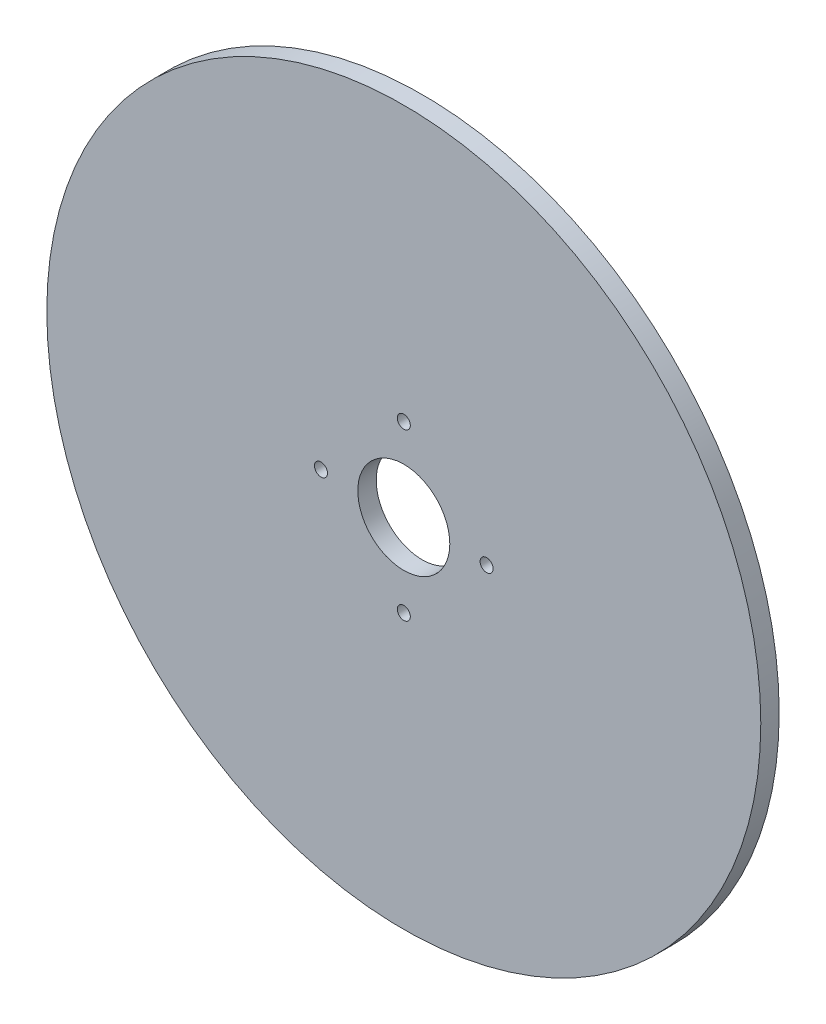
ISO-10303-21;
HEADER;
FILE_DESCRIPTION(('STEP AP214'),'2;1');
FILE_NAME('part.step','',(''),(''),'','','');
FILE_SCHEMA(('AUTOMOTIVE_DESIGN { 1 0 10303 214 1 1 1 1 }'));
ENDSEC;
DATA;
#1=APPLICATION_CONTEXT('core data for automotive mechanical design processes');
#2=APPLICATION_PROTOCOL_DEFINITION('international standard','automotive_design',2000,#1);
#3=PRODUCT_CONTEXT('',#1,'mechanical');
#4=PRODUCT('Part','Part','',(#3));
#5=PRODUCT_RELATED_PRODUCT_CATEGORY('part','',(#4));
#6=PRODUCT_DEFINITION_FORMATION('','',#4);
#7=PRODUCT_DEFINITION_CONTEXT('part definition',#1,'design');
#8=PRODUCT_DEFINITION('design','',#6,#7);
#9=PRODUCT_DEFINITION_SHAPE('','',#8);
#10=(LENGTH_UNIT() NAMED_UNIT(*) SI_UNIT(.MILLI.,.METRE.));
#11=(NAMED_UNIT(*) PLANE_ANGLE_UNIT() SI_UNIT($,.RADIAN.));
#12=(NAMED_UNIT(*) SI_UNIT($,.STERADIAN.) SOLID_ANGLE_UNIT());
#13=UNCERTAINTY_MEASURE_WITH_UNIT(LENGTH_MEASURE(1.E-05),#10,'distance_accuracy_value','');
#14=(GEOMETRIC_REPRESENTATION_CONTEXT(3) GLOBAL_UNCERTAINTY_ASSIGNED_CONTEXT((#13)) GLOBAL_UNIT_ASSIGNED_CONTEXT((#10,
#11,#12)) REPRESENTATION_CONTEXT('',''));
#15=CARTESIAN_POINT('',(0.,0.,0.));
#16=DIRECTION('',(0.,0.,1.));
#17=DIRECTION('',(1.,0.,0.));
#18=AXIS2_PLACEMENT_3D('',#15,#16,#17);
#19=CARTESIAN_POINT('',(0.,0.,6.35));
#20=DIRECTION('',(0.,0.,1.));
#21=DIRECTION('',(1.,0.,0.));
#22=AXIS2_PLACEMENT_3D('',#19,#20,#21);
#23=PLANE('',#22);
#24=CARTESIAN_POINT('',(28.575,0.,6.35));
#25=DIRECTION('',(0.,0.,1.));
#26=DIRECTION('',(1.,0.,0.));
#27=AXIS2_PLACEMENT_3D('',#24,#25,#26);
#28=CIRCLE('',#27,2.25);
#29=CARTESIAN_POINT('',(30.825,0.,6.35));
#30=VERTEX_POINT('',#29);
#31=EDGE_CURVE('E70',#30,#30,#28,.T.);
#32=ORIENTED_EDGE('',*,*,#31,.F.);
#33=EDGE_LOOP('',(#32));
#34=FACE_BOUND('',#33,.T.);
#35=CARTESIAN_POINT('',(0.,28.575,6.35));
#36=DIRECTION('',(0.,0.,1.));
#37=DIRECTION('',(1.,0.,0.));
#38=AXIS2_PLACEMENT_3D('',#35,#36,#37);
#39=CIRCLE('',#38,2.25);
#40=CARTESIAN_POINT('',(2.25000000000001,28.575,6.35));
#41=VERTEX_POINT('',#40);
#42=EDGE_CURVE('E54',#41,#41,#39,.T.);
#43=ORIENTED_EDGE('',*,*,#42,.F.);
#44=EDGE_LOOP('',(#43));
#45=FACE_BOUND('',#44,.T.);
#46=CARTESIAN_POINT('',(0.,0.,6.35));
#47=DIRECTION('',(0.,0.,1.));
#48=DIRECTION('',(1.,0.,0.));
#49=AXIS2_PLACEMENT_3D('',#46,#47,#48);
#50=CIRCLE('',#49,123.19);
#51=CARTESIAN_POINT('',(123.19,0.,6.35));
#52=VERTEX_POINT('',#51);
#53=EDGE_CURVE('E10',#52,#52,#50,.T.);
#54=ORIENTED_EDGE('',*,*,#53,.T.);
#55=EDGE_LOOP('',(#54));
#56=FACE_BOUND('',#55,.T.);
#57=CARTESIAN_POINT('',(0.,0.,6.35));
#58=DIRECTION('',(0.,0.,1.));
#59=DIRECTION('',(1.,0.,0.));
#60=AXIS2_PLACEMENT_3D('',#57,#58,#59);
#61=CIRCLE('',#60,15.875);
#62=CARTESIAN_POINT('',(15.875,0.,6.35));
#63=VERTEX_POINT('',#62);
#64=EDGE_CURVE('E49',#63,#63,#61,.T.);
#65=ORIENTED_EDGE('',*,*,#64,.F.);
#66=EDGE_LOOP('',(#65));
#67=FACE_BOUND('',#66,.T.);
#68=CARTESIAN_POINT('',(-28.575,0.,6.35));
#69=DIRECTION('',(0.,0.,1.));
#70=DIRECTION('',(1.,0.,0.));
#71=AXIS2_PLACEMENT_3D('',#68,#69,#70);
#72=CIRCLE('',#71,2.25);
#73=CARTESIAN_POINT('',(-26.325,0.,6.35));
#74=VERTEX_POINT('',#73);
#75=EDGE_CURVE('E64',#74,#74,#72,.T.);
#76=ORIENTED_EDGE('',*,*,#75,.F.);
#77=EDGE_LOOP('',(#76));
#78=FACE_BOUND('',#77,.T.);
#79=CARTESIAN_POINT('',(0.,-28.575,6.35));
#80=DIRECTION('',(0.,0.,1.));
#81=DIRECTION('',(1.,0.,0.));
#82=AXIS2_PLACEMENT_3D('',#79,#80,#81);
#83=CIRCLE('',#82,2.25);
#84=CARTESIAN_POINT('',(2.25000000000001,-28.575,6.35));
#85=VERTEX_POINT('',#84);
#86=EDGE_CURVE('E71',#85,#85,#83,.T.);
#87=ORIENTED_EDGE('',*,*,#86,.F.);
#88=EDGE_LOOP('',(#87));
#89=FACE_BOUND('',#88,.T.);
#90=ADVANCED_FACE('F39',(#34,#45,#56,#67,#78,#89),#23,.T.);
#91=CARTESIAN_POINT('',(0.,0.,0.));
#92=DIRECTION('',(0.,0.,1.));
#93=DIRECTION('',(1.,0.,0.));
#94=AXIS2_PLACEMENT_3D('',#91,#92,#93);
#95=PLANE('',#94);
#96=CARTESIAN_POINT('',(0.,0.,0.));
#97=DIRECTION('',(0.,0.,1.));
#98=DIRECTION('',(1.,0.,0.));
#99=AXIS2_PLACEMENT_3D('',#96,#97,#98);
#100=CIRCLE('',#99,123.19);
#101=CARTESIAN_POINT('',(123.19,0.,0.));
#102=VERTEX_POINT('',#101);
#103=EDGE_CURVE('E43',#102,#102,#100,.T.);
#104=ORIENTED_EDGE('',*,*,#103,.F.);
#105=EDGE_LOOP('',(#104));
#106=FACE_BOUND('',#105,.T.);
#107=CARTESIAN_POINT('',(0.,0.,0.));
#108=DIRECTION('',(0.,0.,1.));
#109=DIRECTION('',(1.,0.,0.));
#110=AXIS2_PLACEMENT_3D('',#107,#108,#109);
#111=CIRCLE('',#110,15.875);
#112=CARTESIAN_POINT('',(15.875,0.,0.));
#113=VERTEX_POINT('',#112);
#114=EDGE_CURVE('E55',#113,#113,#111,.T.);
#115=ORIENTED_EDGE('',*,*,#114,.T.);
#116=EDGE_LOOP('',(#115));
#117=FACE_BOUND('',#116,.T.);
#118=CARTESIAN_POINT('',(0.,28.575,0.));
#119=DIRECTION('',(0.,0.,1.));
#120=DIRECTION('',(1.,0.,0.));
#121=AXIS2_PLACEMENT_3D('',#118,#119,#120);
#122=CIRCLE('',#121,2.25);
#123=CARTESIAN_POINT('',(2.25000000000001,28.575,0.));
#124=VERTEX_POINT('',#123);
#125=EDGE_CURVE('E59',#124,#124,#122,.T.);
#126=ORIENTED_EDGE('',*,*,#125,.T.);
#127=EDGE_LOOP('',(#126));
#128=FACE_BOUND('',#127,.T.);
#129=CARTESIAN_POINT('',(-28.575,0.,0.));
#130=DIRECTION('',(0.,0.,1.));
#131=DIRECTION('',(1.,0.,0.));
#132=AXIS2_PLACEMENT_3D('',#129,#130,#131);
#133=CIRCLE('',#132,2.25);
#134=CARTESIAN_POINT('',(-26.325,0.,0.));
#135=VERTEX_POINT('',#134);
#136=EDGE_CURVE('E63',#135,#135,#133,.T.);
#137=ORIENTED_EDGE('',*,*,#136,.T.);
#138=EDGE_LOOP('',(#137));
#139=FACE_BOUND('',#138,.T.);
#140=CARTESIAN_POINT('',(28.575,0.,0.));
#141=DIRECTION('',(0.,0.,1.));
#142=DIRECTION('',(1.,0.,0.));
#143=AXIS2_PLACEMENT_3D('',#140,#141,#142);
#144=CIRCLE('',#143,2.25);
#145=CARTESIAN_POINT('',(30.825,0.,0.));
#146=VERTEX_POINT('',#145);
#147=EDGE_CURVE('E67',#146,#146,#144,.T.);
#148=ORIENTED_EDGE('',*,*,#147,.T.);
#149=EDGE_LOOP('',(#148));
#150=FACE_BOUND('',#149,.T.);
#151=CARTESIAN_POINT('',(0.,-28.575,0.));
#152=DIRECTION('',(0.,0.,1.));
#153=DIRECTION('',(1.,0.,0.));
#154=AXIS2_PLACEMENT_3D('',#151,#152,#153);
#155=CIRCLE('',#154,2.25);
#156=CARTESIAN_POINT('',(2.25000000000001,-28.575,0.));
#157=VERTEX_POINT('',#156);
#158=EDGE_CURVE('E79',#157,#157,#155,.T.);
#159=ORIENTED_EDGE('',*,*,#158,.T.);
#160=EDGE_LOOP('',(#159));
#161=FACE_BOUND('',#160,.T.);
#162=ADVANCED_FACE('F88',(#106,#117,#128,#139,#150,#161),#95,.F.);
#163=CARTESIAN_POINT('',(0.,0.,6.35));
#164=DIRECTION('',(0.,0.,-1.));
#165=DIRECTION('',(-1.,0.,0.));
#166=AXIS2_PLACEMENT_3D('',#163,#164,#165);
#167=CYLINDRICAL_SURFACE('',#166,123.19);
#168=ORIENTED_EDGE('',*,*,#53,.F.);
#169=EDGE_LOOP('',(#168));
#170=FACE_BOUND('',#169,.T.);
#171=ORIENTED_EDGE('',*,*,#103,.T.);
#172=EDGE_LOOP('',(#171));
#173=FACE_BOUND('',#172,.T.);
#174=ADVANCED_FACE('F41',(#170,#173),#167,.T.);
#175=CARTESIAN_POINT('',(0.,0.,6.35));
#176=DIRECTION('',(0.,0.,-1.));
#177=DIRECTION('',(-1.,0.,0.));
#178=AXIS2_PLACEMENT_3D('',#175,#176,#177);
#179=CYLINDRICAL_SURFACE('',#178,15.875);
#180=ORIENTED_EDGE('',*,*,#64,.T.);
#181=EDGE_LOOP('',(#180));
#182=FACE_BOUND('',#181,.T.);
#183=ORIENTED_EDGE('',*,*,#114,.F.);
#184=EDGE_LOOP('',(#183));
#185=FACE_BOUND('',#184,.T.);
#186=ADVANCED_FACE('F96',(#182,#185),#179,.F.);
#187=CARTESIAN_POINT('',(0.,28.575,6.35));
#188=DIRECTION('',(0.,0.,-1.));
#189=DIRECTION('',(-1.,0.,0.));
#190=AXIS2_PLACEMENT_3D('',#187,#188,#189);
#191=CYLINDRICAL_SURFACE('',#190,2.25);
#192=ORIENTED_EDGE('',*,*,#42,.T.);
#193=EDGE_LOOP('',(#192));
#194=FACE_BOUND('',#193,.T.);
#195=ORIENTED_EDGE('',*,*,#125,.F.);
#196=EDGE_LOOP('',(#195));
#197=FACE_BOUND('',#196,.T.);
#198=ADVANCED_FACE('F97',(#194,#197),#191,.F.);
#199=CARTESIAN_POINT('',(-28.575,0.,6.35));
#200=DIRECTION('',(0.,0.,-1.));
#201=DIRECTION('',(-1.,0.,0.));
#202=AXIS2_PLACEMENT_3D('',#199,#200,#201);
#203=CYLINDRICAL_SURFACE('',#202,2.25);
#204=ORIENTED_EDGE('',*,*,#75,.T.);
#205=EDGE_LOOP('',(#204));
#206=FACE_BOUND('',#205,.T.);
#207=ORIENTED_EDGE('',*,*,#136,.F.);
#208=EDGE_LOOP('',(#207));
#209=FACE_BOUND('',#208,.T.);
#210=ADVANCED_FACE('F103',(#206,#209),#203,.F.);
#211=CARTESIAN_POINT('',(28.575,0.,6.35));
#212=DIRECTION('',(0.,0.,-1.));
#213=DIRECTION('',(-1.,0.,0.));
#214=AXIS2_PLACEMENT_3D('',#211,#212,#213);
#215=CYLINDRICAL_SURFACE('',#214,2.25);
#216=ORIENTED_EDGE('',*,*,#31,.T.);
#217=EDGE_LOOP('',(#216));
#218=FACE_BOUND('',#217,.T.);
#219=ORIENTED_EDGE('',*,*,#147,.F.);
#220=EDGE_LOOP('',(#219));
#221=FACE_BOUND('',#220,.T.);
#222=ADVANCED_FACE('F110',(#218,#221),#215,.F.);
#223=CARTESIAN_POINT('',(0.,-28.575,6.35));
#224=DIRECTION('',(0.,0.,-1.));
#225=DIRECTION('',(-1.,0.,0.));
#226=AXIS2_PLACEMENT_3D('',#223,#224,#225);
#227=CYLINDRICAL_SURFACE('',#226,2.25);
#228=ORIENTED_EDGE('',*,*,#86,.T.);
#229=EDGE_LOOP('',(#228));
#230=FACE_BOUND('',#229,.T.);
#231=ORIENTED_EDGE('',*,*,#158,.F.);
#232=EDGE_LOOP('',(#231));
#233=FACE_BOUND('',#232,.T.);
#234=ADVANCED_FACE('F85',(#230,#233),#227,.F.);
#235=CLOSED_SHELL('',(#90,#162,#174,#186,#198,#210,#222,#234));
#236=MANIFOLD_SOLID_BREP('B2',#235);
#237=ADVANCED_BREP_SHAPE_REPRESENTATION('',(#18,#236),#14);
#238=SHAPE_DEFINITION_REPRESENTATION(#9,#237);
ENDSEC;
END-ISO-10303-21;
